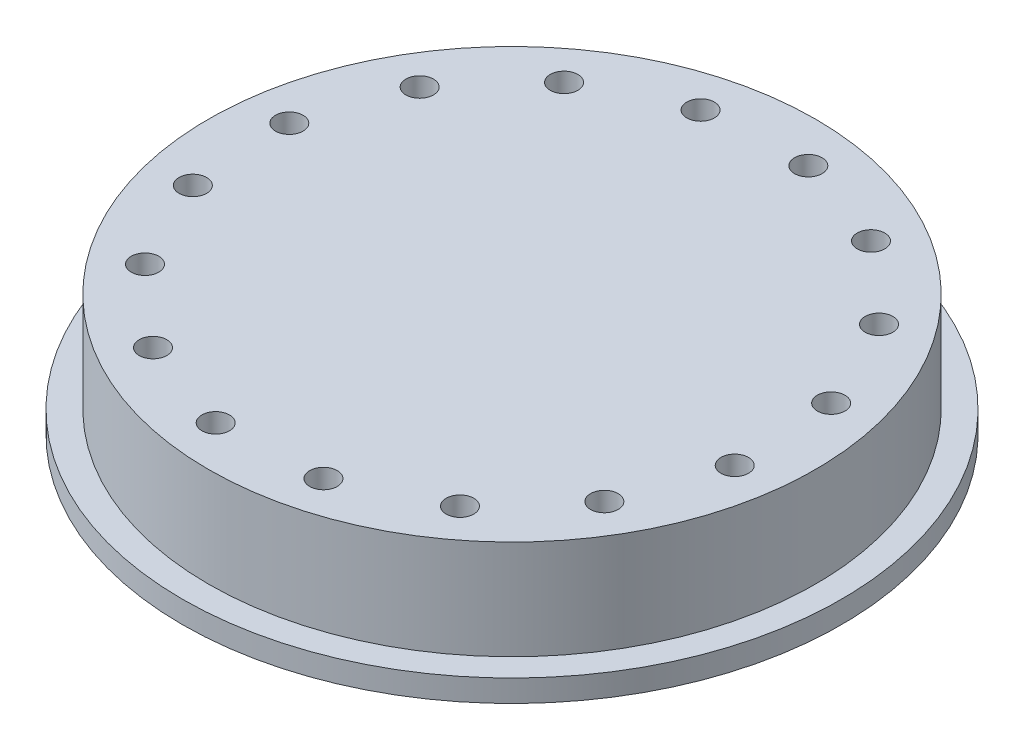
ISO-10303-21;
HEADER;
FILE_DESCRIPTION(('STEP AP214'),'2;1');
FILE_NAME('part.step','',(''),(''),'','','');
FILE_SCHEMA(('AUTOMOTIVE_DESIGN { 1 0 10303 214 1 1 1 1 }'));
ENDSEC;
DATA;
#1=APPLICATION_CONTEXT('core data for automotive mechanical design processes');
#2=APPLICATION_PROTOCOL_DEFINITION('international standard','automotive_design',2000,#1);
#3=PRODUCT_CONTEXT('',#1,'mechanical');
#4=PRODUCT('Part','Part','',(#3));
#5=PRODUCT_RELATED_PRODUCT_CATEGORY('part','',(#4));
#6=PRODUCT_DEFINITION_FORMATION('','',#4);
#7=PRODUCT_DEFINITION_CONTEXT('part definition',#1,'design');
#8=PRODUCT_DEFINITION('design','',#6,#7);
#9=PRODUCT_DEFINITION_SHAPE('','',#8);
#10=(LENGTH_UNIT() NAMED_UNIT(*) SI_UNIT(.MILLI.,.METRE.));
#11=(NAMED_UNIT(*) PLANE_ANGLE_UNIT() SI_UNIT($,.RADIAN.));
#12=(NAMED_UNIT(*) SI_UNIT($,.STERADIAN.) SOLID_ANGLE_UNIT());
#13=UNCERTAINTY_MEASURE_WITH_UNIT(LENGTH_MEASURE(1.E-05),#10,'distance_accuracy_value','');
#14=(GEOMETRIC_REPRESENTATION_CONTEXT(3) GLOBAL_UNCERTAINTY_ASSIGNED_CONTEXT((#13)) GLOBAL_UNIT_ASSIGNED_CONTEXT((#10,
#11,#12)) REPRESENTATION_CONTEXT('',''));
#15=CARTESIAN_POINT('',(0.,0.,0.));
#16=DIRECTION('',(0.,0.,1.));
#17=DIRECTION('',(1.,0.,0.));
#18=AXIS2_PLACEMENT_3D('',#15,#16,#17);
#19=CARTESIAN_POINT('',(0.,1.,0.));
#20=DIRECTION('',(0.,-1.,0.));
#21=DIRECTION('',(0.,0.,-1.));
#22=AXIS2_PLACEMENT_3D('',#19,#20,#21);
#23=CYLINDRICAL_SURFACE('',#22,29.86111111);
#24=CARTESIAN_POINT('',(0.,1.,0.));
#25=DIRECTION('',(0.,1.,0.));
#26=DIRECTION('',(0.,0.,1.));
#27=AXIS2_PLACEMENT_3D('',#24,#25,#26);
#28=CIRCLE('',#27,29.86111111);
#29=CARTESIAN_POINT('',(0.,1.,29.86111111));
#30=VERTEX_POINT('',#29);
#31=EDGE_CURVE('E44',#30,#30,#28,.T.);
#32=ORIENTED_EDGE('',*,*,#31,.F.);
#33=EDGE_LOOP('',(#32));
#34=FACE_BOUND('',#33,.T.);
#35=CARTESIAN_POINT('',(0.,-1.,0.));
#36=DIRECTION('',(0.,1.,0.));
#37=DIRECTION('',(0.,0.,1.));
#38=AXIS2_PLACEMENT_3D('',#35,#36,#37);
#39=CIRCLE('',#38,29.86111111);
#40=CARTESIAN_POINT('',(0.,-1.,29.86111111));
#41=VERTEX_POINT('',#40);
#42=EDGE_CURVE('E40',#41,#41,#39,.T.);
#43=ORIENTED_EDGE('',*,*,#42,.T.);
#44=EDGE_LOOP('',(#43));
#45=FACE_BOUND('',#44,.T.);
#46=ADVANCED_FACE('F37',(#34,#45),#23,.T.);
#47=CARTESIAN_POINT('',(0.,1.,0.));
#48=DIRECTION('',(0.,1.,0.));
#49=DIRECTION('',(0.,0.,1.));
#50=AXIS2_PLACEMENT_3D('',#47,#48,#49);
#51=PLANE('',#50);
#52=CARTESIAN_POINT('',(0.,1.,0.));
#53=DIRECTION('',(0.,1.,0.));
#54=DIRECTION('',(0.,0.,1.));
#55=AXIS2_PLACEMENT_3D('',#52,#53,#54);
#56=CIRCLE('',#55,27.5);
#57=CARTESIAN_POINT('',(0.,1.,27.5));
#58=VERTEX_POINT('',#57);
#59=EDGE_CURVE('E10',#58,#58,#56,.T.);
#60=ORIENTED_EDGE('',*,*,#59,.F.);
#61=EDGE_LOOP('',(#60));
#62=FACE_BOUND('',#61,.T.);
#63=ORIENTED_EDGE('',*,*,#31,.T.);
#64=EDGE_LOOP('',(#63));
#65=FACE_BOUND('',#64,.T.);
#66=ADVANCED_FACE('F165',(#62,#65),#51,.T.);
#67=CARTESIAN_POINT('',(0.,-1.,0.));
#68=DIRECTION('',(0.,1.,0.));
#69=DIRECTION('',(0.,0.,1.));
#70=AXIS2_PLACEMENT_3D('',#67,#68,#69);
#71=PLANE('',#70);
#72=CARTESIAN_POINT('',(18.9855230536122,-1.,-14.2692821957078));
#73=DIRECTION('',(0.,1.,0.));
#74=DIRECTION('',(0.,0.,1.));
#75=AXIS2_PLACEMENT_3D('',#72,#73,#74);
#76=CIRCLE('',#75,1.25);
#77=CARTESIAN_POINT('',(18.9855230536122,-1.,-13.0192821957078));
#78=VERTEX_POINT('',#77);
#79=EDGE_CURVE('E53',#78,#78,#76,.T.);
#80=ORIENTED_EDGE('',*,*,#79,.T.);
#81=EDGE_LOOP('',(#80));
#82=FACE_BOUND('',#81,.T.);
#83=CARTESIAN_POINT('',(14.2692821957152,-1.,18.9855230536135));
#84=DIRECTION('',(0.,1.,0.));
#85=DIRECTION('',(0.,0.,1.));
#86=AXIS2_PLACEMENT_3D('',#83,#84,#85);
#87=CIRCLE('',#86,1.25);
#88=CARTESIAN_POINT('',(14.2692821957152,-1.,20.2355230536135));
#89=VERTEX_POINT('',#88);
#90=EDGE_CURVE('E56',#89,#89,#87,.T.);
#91=ORIENTED_EDGE('',*,*,#90,.T.);
#92=EDGE_LOOP('',(#91));
#93=FACE_BOUND('',#92,.T.);
#94=CARTESIAN_POINT('',(20.448542891651,-1.,12.0797182752138));
#95=DIRECTION('',(0.,1.,0.));
#96=DIRECTION('',(0.,0.,1.));
#97=AXIS2_PLACEMENT_3D('',#94,#95,#96);
#98=CIRCLE('',#97,1.25);
#99=CARTESIAN_POINT('',(20.448542891651,-1.,13.3297182752138));
#100=VERTEX_POINT('',#99);
#101=EDGE_CURVE('E59',#100,#100,#98,.T.);
#102=ORIENTED_EDGE('',*,*,#101,.T.);
#103=EDGE_LOOP('',(#102));
#104=FACE_BOUND('',#103,.T.);
#105=CARTESIAN_POINT('',(23.5146982988361,-1.,3.3348858923322));
#106=DIRECTION('',(0.,1.,0.));
#107=DIRECTION('',(0.,0.,1.));
#108=AXIS2_PLACEMENT_3D('',#105,#106,#107);
#109=CIRCLE('',#108,1.25);
#110=CARTESIAN_POINT('',(23.5146982988361,-1.,4.5848858923322));
#111=VERTEX_POINT('',#110);
#112=EDGE_CURVE('E62',#111,#111,#109,.T.);
#113=ORIENTED_EDGE('',*,*,#112,.T.);
#114=EDGE_LOOP('',(#113));
#115=FACE_BOUND('',#114,.T.);
#116=CARTESIAN_POINT('',(5.91765263684751,-1.,23.0009540512963));
#117=DIRECTION('',(0.,1.,0.));
#118=DIRECTION('',(0.,0.,1.));
#119=AXIS2_PLACEMENT_3D('',#116,#117,#118);
#120=CIRCLE('',#119,1.25000000000003);
#121=CARTESIAN_POINT('',(5.91765263684751,-1.,24.2509540512964));
#122=VERTEX_POINT('',#121);
#123=EDGE_CURVE('E65',#122,#122,#120,.T.);
#124=ORIENTED_EDGE('',*,*,#123,.T.);
#125=EDGE_LOOP('',(#124));
#126=FACE_BOUND('',#125,.T.);
#127=CARTESIAN_POINT('',(-3.33488589232507,-1.,23.5146982988376));
#128=DIRECTION('',(0.,1.,0.));
#129=DIRECTION('',(0.,0.,1.));
#130=AXIS2_PLACEMENT_3D('',#127,#128,#129);
#131=CIRCLE('',#130,1.25);
#132=CARTESIAN_POINT('',(-3.33488589232507,-1.,24.7646982988376));
#133=VERTEX_POINT('',#132);
#134=EDGE_CURVE('E68',#133,#133,#131,.T.);
#135=ORIENTED_EDGE('',*,*,#134,.T.);
#136=EDGE_LOOP('',(#135));
#137=FACE_BOUND('',#136,.T.);
#138=CARTESIAN_POINT('',(-12.0797182752067,-1.,20.4485428916524));
#139=DIRECTION('',(0.,1.,0.));
#140=DIRECTION('',(0.,0.,1.));
#141=AXIS2_PLACEMENT_3D('',#138,#139,#140);
#142=CIRCLE('',#141,1.24999999999998);
#143=CARTESIAN_POINT('',(-12.0797182752067,-1.,21.6985428916524));
#144=VERTEX_POINT('',#143);
#145=EDGE_CURVE('E71',#144,#144,#142,.T.);
#146=ORIENTED_EDGE('',*,*,#145,.T.);
#147=EDGE_LOOP('',(#146));
#148=FACE_BOUND('',#147,.T.);
#149=CARTESIAN_POINT('',(-18.9855230536064,-1.,14.2692821957167));
#150=DIRECTION('',(0.,1.,0.));
#151=DIRECTION('',(0.,0.,1.));
#152=AXIS2_PLACEMENT_3D('',#149,#150,#151);
#153=CIRCLE('',#152,1.25);
#154=CARTESIAN_POINT('',(-18.9855230536064,-1.,15.5192821957167));
#155=VERTEX_POINT('',#154);
#156=EDGE_CURVE('E74',#155,#155,#153,.T.);
#157=ORIENTED_EDGE('',*,*,#156,.T.);
#158=EDGE_LOOP('',(#157));
#159=FACE_BOUND('',#158,.T.);
#160=CARTESIAN_POINT('',(-20.4485428916452,-1.,-12.0797182752052));
#161=DIRECTION('',(0.,1.,0.));
#162=DIRECTION('',(0.,0.,1.));
#163=AXIS2_PLACEMENT_3D('',#160,#161,#162);
#164=CIRCLE('',#163,1.25);
#165=CARTESIAN_POINT('',(-20.4485428916452,-1.,-10.8297182752052));
#166=VERTEX_POINT('',#165);
#167=EDGE_CURVE('E77',#166,#166,#164,.T.);
#168=ORIENTED_EDGE('',*,*,#167,.T.);
#169=EDGE_LOOP('',(#168));
#170=FACE_BOUND('',#169,.T.);
#171=CARTESIAN_POINT('',(-14.2692821957094,-1.,-18.9855230536049));
#172=DIRECTION('',(0.,1.,0.));
#173=DIRECTION('',(0.,0.,1.));
#174=AXIS2_PLACEMENT_3D('',#171,#172,#173);
#175=CIRCLE('',#174,1.24999999999999);
#176=CARTESIAN_POINT('',(-14.2692821957094,-1.,-17.7355230536049));
#177=VERTEX_POINT('',#176);
#178=EDGE_CURVE('E80',#177,#177,#175,.T.);
#179=ORIENTED_EDGE('',*,*,#178,.T.);
#180=EDGE_LOOP('',(#179));
#181=FACE_BOUND('',#180,.T.);
#182=CARTESIAN_POINT('',(-5.91765263684165,-1.,-23.0009540512877));
#183=DIRECTION('',(0.,1.,0.));
#184=DIRECTION('',(0.,0.,1.));
#185=AXIS2_PLACEMENT_3D('',#182,#183,#184);
#186=CIRCLE('',#185,1.25000000000002);
#187=CARTESIAN_POINT('',(-5.91765263684165,-1.,-21.7509540512877));
#188=VERTEX_POINT('',#187);
#189=EDGE_CURVE('E83',#188,#188,#186,.T.);
#190=ORIENTED_EDGE('',*,*,#189,.T.);
#191=EDGE_LOOP('',(#190));
#192=FACE_BOUND('',#191,.T.);
#193=CARTESIAN_POINT('',(3.33488589233093,-1.,-23.5146982988289));
#194=DIRECTION('',(0.,1.,0.));
#195=DIRECTION('',(0.,0.,1.));
#196=AXIS2_PLACEMENT_3D('',#193,#194,#195);
#197=CIRCLE('',#196,1.25);
#198=CARTESIAN_POINT('',(3.33488589233093,-1.,-22.2646982988289));
#199=VERTEX_POINT('',#198);
#200=EDGE_CURVE('E86',#199,#199,#197,.T.);
#201=ORIENTED_EDGE('',*,*,#200,.T.);
#202=EDGE_LOOP('',(#201));
#203=FACE_BOUND('',#202,.T.);
#204=CARTESIAN_POINT('',(12.0797182752125,-1.,-20.4485428916436));
#205=DIRECTION('',(0.,1.,0.));
#206=DIRECTION('',(0.,0.,1.));
#207=AXIS2_PLACEMENT_3D('',#204,#205,#206);
#208=CIRCLE('',#207,1.25);
#209=CARTESIAN_POINT('',(12.0797182752125,-1.,-19.1985428916436));
#210=VERTEX_POINT('',#209);
#211=EDGE_CURVE('E89',#210,#210,#208,.T.);
#212=ORIENTED_EDGE('',*,*,#211,.T.);
#213=EDGE_LOOP('',(#212));
#214=FACE_BOUND('',#213,.T.);
#215=CARTESIAN_POINT('',(-23.5146982988304,-1.,-3.33488589232348));
#216=DIRECTION('',(0.,1.,0.));
#217=DIRECTION('',(0.,0.,1.));
#218=AXIS2_PLACEMENT_3D('',#215,#216,#217);
#219=CIRCLE('',#218,1.25);
#220=CARTESIAN_POINT('',(-23.5146982988304,-1.,-2.08488589232348));
#221=VERTEX_POINT('',#220);
#222=EDGE_CURVE('E92',#221,#221,#219,.T.);
#223=ORIENTED_EDGE('',*,*,#222,.T.);
#224=EDGE_LOOP('',(#223));
#225=FACE_BOUND('',#224,.T.);
#226=CARTESIAN_POINT('',(-23.0009540512891,-1.,5.91765263684895));
#227=DIRECTION('',(0.,1.,0.));
#228=DIRECTION('',(0.,0.,1.));
#229=AXIS2_PLACEMENT_3D('',#226,#227,#228);
#230=CIRCLE('',#229,1.25);
#231=CARTESIAN_POINT('',(-23.0009540512891,-1.,7.16765263684895));
#232=VERTEX_POINT('',#231);
#233=EDGE_CURVE('E95',#232,#232,#230,.T.);
#234=ORIENTED_EDGE('',*,*,#233,.T.);
#235=EDGE_LOOP('',(#234));
#236=FACE_BOUND('',#235,.T.);
#237=CARTESIAN_POINT('',(23.0009540512949,-1.,-5.91765263684006));
#238=DIRECTION('',(0.,1.,0.));
#239=DIRECTION('',(0.,0.,1.));
#240=AXIS2_PLACEMENT_3D('',#237,#238,#239);
#241=CIRCLE('',#240,1.25);
#242=CARTESIAN_POINT('',(23.0009540512949,-1.,-4.66765263684005));
#243=VERTEX_POINT('',#242);
#244=EDGE_CURVE('E98',#243,#243,#241,.T.);
#245=ORIENTED_EDGE('',*,*,#244,.T.);
#246=EDGE_LOOP('',(#245));
#247=FACE_BOUND('',#246,.T.);
#248=ORIENTED_EDGE('',*,*,#42,.F.);
#249=EDGE_LOOP('',(#248));
#250=FACE_BOUND('',#249,.T.);
#251=ADVANCED_FACE('F161',(#82,#93,#104,#115,#126,#137,#148,#159,#170,#181,#192,#203,#214,#225,
#236,#247,#250),#71,.F.);
#252=CARTESIAN_POINT('',(0.,10.,0.));
#253=DIRECTION('',(0.,-1.,0.));
#254=DIRECTION('',(0.,0.,-1.));
#255=AXIS2_PLACEMENT_3D('',#252,#253,#254);
#256=CYLINDRICAL_SURFACE('',#255,27.5);
#257=CARTESIAN_POINT('',(0.,10.,0.));
#258=DIRECTION('',(0.,1.,0.));
#259=DIRECTION('',(0.,0.,1.));
#260=AXIS2_PLACEMENT_3D('',#257,#258,#259);
#261=CIRCLE('',#260,27.5);
#262=CARTESIAN_POINT('',(0.,10.,27.5));
#263=VERTEX_POINT('',#262);
#264=EDGE_CURVE('E50',#263,#263,#261,.T.);
#265=ORIENTED_EDGE('',*,*,#264,.F.);
#266=EDGE_LOOP('',(#265));
#267=FACE_BOUND('',#266,.T.);
#268=ORIENTED_EDGE('',*,*,#59,.T.);
#269=EDGE_LOOP('',(#268));
#270=FACE_BOUND('',#269,.T.);
#271=ADVANCED_FACE('F164',(#267,#270),#256,.T.);
#272=CARTESIAN_POINT('',(0.,10.,0.));
#273=DIRECTION('',(0.,1.,0.));
#274=DIRECTION('',(0.,0.,1.));
#275=AXIS2_PLACEMENT_3D('',#272,#273,#274);
#276=PLANE('',#275);
#277=CARTESIAN_POINT('',(18.9855230536122,10.,-14.2692821957078));
#278=DIRECTION('',(0.,-1.,0.));
#279=DIRECTION('',(0.,0.,-1.));
#280=AXIS2_PLACEMENT_3D('',#277,#278,#279);
#281=CIRCLE('',#280,1.25);
#282=CARTESIAN_POINT('',(18.9855230536122,10.,-15.5192821957078));
#283=VERTEX_POINT('',#282);
#284=EDGE_CURVE('E118',#283,#283,#281,.T.);
#285=ORIENTED_EDGE('',*,*,#284,.T.);
#286=EDGE_LOOP('',(#285));
#287=FACE_BOUND('',#286,.T.);
#288=CARTESIAN_POINT('',(14.2692821957152,10.,18.9855230536135));
#289=DIRECTION('',(0.,-1.,0.));
#290=DIRECTION('',(0.,0.,-1.));
#291=AXIS2_PLACEMENT_3D('',#288,#289,#290);
#292=CIRCLE('',#291,1.25);
#293=CARTESIAN_POINT('',(14.2692821957152,10.,17.7355230536135));
#294=VERTEX_POINT('',#293);
#295=EDGE_CURVE('E122',#294,#294,#292,.T.);
#296=ORIENTED_EDGE('',*,*,#295,.T.);
#297=EDGE_LOOP('',(#296));
#298=FACE_BOUND('',#297,.T.);
#299=CARTESIAN_POINT('',(20.448542891651,10.,12.0797182752138));
#300=DIRECTION('',(0.,-1.,0.));
#301=DIRECTION('',(0.,0.,-1.));
#302=AXIS2_PLACEMENT_3D('',#299,#300,#301);
#303=CIRCLE('',#302,1.25);
#304=CARTESIAN_POINT('',(20.448542891651,10.,10.8297182752138));
#305=VERTEX_POINT('',#304);
#306=EDGE_CURVE('E119',#305,#305,#303,.T.);
#307=ORIENTED_EDGE('',*,*,#306,.T.);
#308=EDGE_LOOP('',(#307));
#309=FACE_BOUND('',#308,.T.);
#310=CARTESIAN_POINT('',(23.5146982988361,10.,3.3348858923322));
#311=DIRECTION('',(0.,-1.,0.));
#312=DIRECTION('',(0.,0.,-1.));
#313=AXIS2_PLACEMENT_3D('',#310,#311,#312);
#314=CIRCLE('',#313,1.25);
#315=CARTESIAN_POINT('',(23.5146982988361,10.,2.08488589233219));
#316=VERTEX_POINT('',#315);
#317=EDGE_CURVE('E104',#316,#316,#314,.T.);
#318=ORIENTED_EDGE('',*,*,#317,.T.);
#319=EDGE_LOOP('',(#318));
#320=FACE_BOUND('',#319,.T.);
#321=CARTESIAN_POINT('',(5.91765263684751,10.,23.0009540512963));
#322=DIRECTION('',(0.,-1.,0.));
#323=DIRECTION('',(0.,0.,-1.));
#324=AXIS2_PLACEMENT_3D('',#321,#322,#323);
#325=CIRCLE('',#324,1.25000000000003);
#326=CARTESIAN_POINT('',(5.91765263684751,10.,21.7509540512963));
#327=VERTEX_POINT('',#326);
#328=EDGE_CURVE('E115',#327,#327,#325,.T.);
#329=ORIENTED_EDGE('',*,*,#328,.T.);
#330=EDGE_LOOP('',(#329));
#331=FACE_BOUND('',#330,.T.);
#332=CARTESIAN_POINT('',(-3.33488589232507,10.,23.5146982988376));
#333=DIRECTION('',(0.,-1.,0.));
#334=DIRECTION('',(0.,0.,-1.));
#335=AXIS2_PLACEMENT_3D('',#332,#333,#334);
#336=CIRCLE('',#335,1.25);
#337=CARTESIAN_POINT('',(-3.33488589232507,10.,22.2646982988376));
#338=VERTEX_POINT('',#337);
#339=EDGE_CURVE('E112',#338,#338,#336,.T.);
#340=ORIENTED_EDGE('',*,*,#339,.T.);
#341=EDGE_LOOP('',(#340));
#342=FACE_BOUND('',#341,.T.);
#343=CARTESIAN_POINT('',(-12.0797182752067,10.,20.4485428916524));
#344=DIRECTION('',(0.,-1.,0.));
#345=DIRECTION('',(0.,0.,-1.));
#346=AXIS2_PLACEMENT_3D('',#343,#344,#345);
#347=CIRCLE('',#346,1.24999999999998);
#348=CARTESIAN_POINT('',(-12.0797182752067,10.,19.1985428916525));
#349=VERTEX_POINT('',#348);
#350=EDGE_CURVE('E108',#349,#349,#347,.T.);
#351=ORIENTED_EDGE('',*,*,#350,.T.);
#352=EDGE_LOOP('',(#351));
#353=FACE_BOUND('',#352,.T.);
#354=CARTESIAN_POINT('',(-18.9855230536064,10.,14.2692821957167));
#355=DIRECTION('',(0.,-1.,0.));
#356=DIRECTION('',(0.,0.,-1.));
#357=AXIS2_PLACEMENT_3D('',#354,#355,#356);
#358=CIRCLE('',#357,1.25);
#359=CARTESIAN_POINT('',(-18.9855230536064,10.,13.0192821957167));
#360=VERTEX_POINT('',#359);
#361=EDGE_CURVE('E105',#360,#360,#358,.T.);
#362=ORIENTED_EDGE('',*,*,#361,.T.);
#363=EDGE_LOOP('',(#362));
#364=FACE_BOUND('',#363,.T.);
#365=CARTESIAN_POINT('',(-20.4485428916452,10.,-12.0797182752052));
#366=DIRECTION('',(0.,-1.,0.));
#367=DIRECTION('',(0.,0.,-1.));
#368=AXIS2_PLACEMENT_3D('',#365,#366,#367);
#369=CIRCLE('',#368,1.25);
#370=CARTESIAN_POINT('',(-20.4485428916452,10.,-13.3297182752052));
#371=VERTEX_POINT('',#370);
#372=EDGE_CURVE('E141',#371,#371,#369,.T.);
#373=ORIENTED_EDGE('',*,*,#372,.T.);
#374=EDGE_LOOP('',(#373));
#375=FACE_BOUND('',#374,.T.);
#376=CARTESIAN_POINT('',(-14.2692821957094,10.,-18.9855230536049));
#377=DIRECTION('',(0.,-1.,0.));
#378=DIRECTION('',(0.,0.,-1.));
#379=AXIS2_PLACEMENT_3D('',#376,#377,#378);
#380=CIRCLE('',#379,1.24999999999999);
#381=CARTESIAN_POINT('',(-14.2692821957094,10.,-20.2355230536049));
#382=VERTEX_POINT('',#381);
#383=EDGE_CURVE('E144',#382,#382,#380,.T.);
#384=ORIENTED_EDGE('',*,*,#383,.T.);
#385=EDGE_LOOP('',(#384));
#386=FACE_BOUND('',#385,.T.);
#387=CARTESIAN_POINT('',(-5.91765263684165,10.,-23.0009540512877));
#388=DIRECTION('',(0.,-1.,0.));
#389=DIRECTION('',(0.,0.,-1.));
#390=AXIS2_PLACEMENT_3D('',#387,#388,#389);
#391=CIRCLE('',#390,1.25000000000002);
#392=CARTESIAN_POINT('',(-5.91765263684165,10.,-24.2509540512877));
#393=VERTEX_POINT('',#392);
#394=EDGE_CURVE('E133',#393,#393,#391,.T.);
#395=ORIENTED_EDGE('',*,*,#394,.T.);
#396=EDGE_LOOP('',(#395));
#397=FACE_BOUND('',#396,.T.);
#398=CARTESIAN_POINT('',(3.33488589233093,10.,-23.5146982988289));
#399=DIRECTION('',(0.,-1.,0.));
#400=DIRECTION('',(0.,0.,-1.));
#401=AXIS2_PLACEMENT_3D('',#398,#399,#400);
#402=CIRCLE('',#401,1.25);
#403=CARTESIAN_POINT('',(3.33488589233093,10.,-24.7646982988289));
#404=VERTEX_POINT('',#403);
#405=EDGE_CURVE('E129',#404,#404,#402,.T.);
#406=ORIENTED_EDGE('',*,*,#405,.T.);
#407=EDGE_LOOP('',(#406));
#408=FACE_BOUND('',#407,.T.);
#409=CARTESIAN_POINT('',(12.0797182752125,10.,-20.4485428916436));
#410=DIRECTION('',(0.,-1.,0.));
#411=DIRECTION('',(0.,0.,-1.));
#412=AXIS2_PLACEMENT_3D('',#409,#410,#411);
#413=CIRCLE('',#412,1.25);
#414=CARTESIAN_POINT('',(12.0797182752125,10.,-21.6985428916436));
#415=VERTEX_POINT('',#414);
#416=EDGE_CURVE('E132',#415,#415,#413,.T.);
#417=ORIENTED_EDGE('',*,*,#416,.T.);
#418=EDGE_LOOP('',(#417));
#419=FACE_BOUND('',#418,.T.);
#420=CARTESIAN_POINT('',(-23.5146982988304,10.,-3.33488589232348));
#421=DIRECTION('',(0.,-1.,0.));
#422=DIRECTION('',(0.,0.,-1.));
#423=AXIS2_PLACEMENT_3D('',#420,#421,#422);
#424=CIRCLE('',#423,1.25);
#425=CARTESIAN_POINT('',(-23.5146982988304,10.,-4.58488589232348));
#426=VERTEX_POINT('',#425);
#427=EDGE_CURVE('E136',#426,#426,#424,.T.);
#428=ORIENTED_EDGE('',*,*,#427,.T.);
#429=EDGE_LOOP('',(#428));
#430=FACE_BOUND('',#429,.T.);
#431=CARTESIAN_POINT('',(-23.0009540512891,10.,5.91765263684895));
#432=DIRECTION('',(0.,-1.,0.));
#433=DIRECTION('',(0.,0.,-1.));
#434=AXIS2_PLACEMENT_3D('',#431,#432,#433);
#435=CIRCLE('',#434,1.25);
#436=CARTESIAN_POINT('',(-23.0009540512891,10.,4.66765263684895));
#437=VERTEX_POINT('',#436);
#438=EDGE_CURVE('E109',#437,#437,#435,.T.);
#439=ORIENTED_EDGE('',*,*,#438,.T.);
#440=EDGE_LOOP('',(#439));
#441=FACE_BOUND('',#440,.T.);
#442=CARTESIAN_POINT('',(23.0009540512949,10.,-5.91765263684006));
#443=DIRECTION('',(0.,-1.,0.));
#444=DIRECTION('',(0.,0.,-1.));
#445=AXIS2_PLACEMENT_3D('',#442,#443,#444);
#446=CIRCLE('',#445,1.25);
#447=CARTESIAN_POINT('',(23.0009540512949,10.,-7.16765263684006));
#448=VERTEX_POINT('',#447);
#449=EDGE_CURVE('E101',#448,#448,#446,.T.);
#450=ORIENTED_EDGE('',*,*,#449,.T.);
#451=EDGE_LOOP('',(#450));
#452=FACE_BOUND('',#451,.T.);
#453=ORIENTED_EDGE('',*,*,#264,.T.);
#454=EDGE_LOOP('',(#453));
#455=FACE_BOUND('',#454,.T.);
#456=ADVANCED_FACE('F150',(#287,#298,#309,#320,#331,#342,#353,#364,#375,#386,#397,#408,#419,
#430,#441,#452,#455),#276,.T.);
#457=CARTESIAN_POINT('',(23.0009540512949,10.,-5.91765263684006));
#458=DIRECTION('',(0.,-1.,0.));
#459=DIRECTION('',(0.,0.,-1.));
#460=AXIS2_PLACEMENT_3D('',#457,#458,#459);
#461=CYLINDRICAL_SURFACE('',#460,1.25);
#462=ORIENTED_EDGE('',*,*,#449,.F.);
#463=EDGE_LOOP('',(#462));
#464=FACE_BOUND('',#463,.T.);
#465=ORIENTED_EDGE('',*,*,#244,.F.);
#466=EDGE_LOOP('',(#465));
#467=FACE_BOUND('',#466,.T.);
#468=ADVANCED_FACE('F197',(#464,#467),#461,.F.);
#469=CARTESIAN_POINT('',(-23.0009540512891,10.,5.91765263684895));
#470=DIRECTION('',(0.,-1.,0.));
#471=DIRECTION('',(0.,0.,-1.));
#472=AXIS2_PLACEMENT_3D('',#469,#470,#471);
#473=CYLINDRICAL_SURFACE('',#472,1.25);
#474=ORIENTED_EDGE('',*,*,#438,.F.);
#475=EDGE_LOOP('',(#474));
#476=FACE_BOUND('',#475,.T.);
#477=ORIENTED_EDGE('',*,*,#233,.F.);
#478=EDGE_LOOP('',(#477));
#479=FACE_BOUND('',#478,.T.);
#480=ADVANCED_FACE('F201',(#476,#479),#473,.F.);
#481=CARTESIAN_POINT('',(-23.5146982988304,10.,-3.33488589232348));
#482=DIRECTION('',(0.,-1.,0.));
#483=DIRECTION('',(0.,0.,-1.));
#484=AXIS2_PLACEMENT_3D('',#481,#482,#483);
#485=CYLINDRICAL_SURFACE('',#484,1.25);
#486=ORIENTED_EDGE('',*,*,#427,.F.);
#487=EDGE_LOOP('',(#486));
#488=FACE_BOUND('',#487,.T.);
#489=ORIENTED_EDGE('',*,*,#222,.F.);
#490=EDGE_LOOP('',(#489));
#491=FACE_BOUND('',#490,.T.);
#492=ADVANCED_FACE('F242',(#488,#491),#485,.F.);
#493=CARTESIAN_POINT('',(12.0797182752125,10.,-20.4485428916436));
#494=DIRECTION('',(0.,-1.,0.));
#495=DIRECTION('',(0.,0.,-1.));
#496=AXIS2_PLACEMENT_3D('',#493,#494,#495);
#497=CYLINDRICAL_SURFACE('',#496,1.25);
#498=ORIENTED_EDGE('',*,*,#416,.F.);
#499=EDGE_LOOP('',(#498));
#500=FACE_BOUND('',#499,.T.);
#501=ORIENTED_EDGE('',*,*,#211,.F.);
#502=EDGE_LOOP('',(#501));
#503=FACE_BOUND('',#502,.T.);
#504=ADVANCED_FACE('F238',(#500,#503),#497,.F.);
#505=CARTESIAN_POINT('',(3.33488589233093,10.,-23.5146982988289));
#506=DIRECTION('',(0.,-1.,0.));
#507=DIRECTION('',(0.,0.,-1.));
#508=AXIS2_PLACEMENT_3D('',#505,#506,#507);
#509=CYLINDRICAL_SURFACE('',#508,1.25);
#510=ORIENTED_EDGE('',*,*,#405,.F.);
#511=EDGE_LOOP('',(#510));
#512=FACE_BOUND('',#511,.T.);
#513=ORIENTED_EDGE('',*,*,#200,.F.);
#514=EDGE_LOOP('',(#513));
#515=FACE_BOUND('',#514,.T.);
#516=ADVANCED_FACE('F157',(#512,#515),#509,.F.);
#517=CARTESIAN_POINT('',(-5.91765263684165,10.,-23.0009540512877));
#518=DIRECTION('',(0.,-1.,0.));
#519=DIRECTION('',(0.,0.,-1.));
#520=AXIS2_PLACEMENT_3D('',#517,#518,#519);
#521=CYLINDRICAL_SURFACE('',#520,1.25000000000002);
#522=ORIENTED_EDGE('',*,*,#394,.F.);
#523=EDGE_LOOP('',(#522));
#524=FACE_BOUND('',#523,.T.);
#525=ORIENTED_EDGE('',*,*,#189,.F.);
#526=EDGE_LOOP('',(#525));
#527=FACE_BOUND('',#526,.T.);
#528=ADVANCED_FACE('F153',(#524,#527),#521,.F.);
#529=CARTESIAN_POINT('',(-14.2692821957094,10.,-18.9855230536049));
#530=DIRECTION('',(0.,-1.,0.));
#531=DIRECTION('',(0.,0.,-1.));
#532=AXIS2_PLACEMENT_3D('',#529,#530,#531);
#533=CYLINDRICAL_SURFACE('',#532,1.24999999999999);
#534=ORIENTED_EDGE('',*,*,#383,.F.);
#535=EDGE_LOOP('',(#534));
#536=FACE_BOUND('',#535,.T.);
#537=ORIENTED_EDGE('',*,*,#178,.F.);
#538=EDGE_LOOP('',(#537));
#539=FACE_BOUND('',#538,.T.);
#540=ADVANCED_FACE('F156',(#536,#539),#533,.F.);
#541=CARTESIAN_POINT('',(-20.4485428916452,10.,-12.0797182752052));
#542=DIRECTION('',(0.,-1.,0.));
#543=DIRECTION('',(0.,0.,-1.));
#544=AXIS2_PLACEMENT_3D('',#541,#542,#543);
#545=CYLINDRICAL_SURFACE('',#544,1.25);
#546=ORIENTED_EDGE('',*,*,#372,.F.);
#547=EDGE_LOOP('',(#546));
#548=FACE_BOUND('',#547,.T.);
#549=ORIENTED_EDGE('',*,*,#167,.F.);
#550=EDGE_LOOP('',(#549));
#551=FACE_BOUND('',#550,.T.);
#552=ADVANCED_FACE('F207',(#548,#551),#545,.F.);
#553=CARTESIAN_POINT('',(-18.9855230536064,10.,14.2692821957167));
#554=DIRECTION('',(0.,-1.,0.));
#555=DIRECTION('',(0.,0.,-1.));
#556=AXIS2_PLACEMENT_3D('',#553,#554,#555);
#557=CYLINDRICAL_SURFACE('',#556,1.25);
#558=ORIENTED_EDGE('',*,*,#361,.F.);
#559=EDGE_LOOP('',(#558));
#560=FACE_BOUND('',#559,.T.);
#561=ORIENTED_EDGE('',*,*,#156,.F.);
#562=EDGE_LOOP('',(#561));
#563=FACE_BOUND('',#562,.T.);
#564=ADVANCED_FACE('F203',(#560,#563),#557,.F.);
#565=CARTESIAN_POINT('',(-12.0797182752067,10.,20.4485428916524));
#566=DIRECTION('',(0.,-1.,0.));
#567=DIRECTION('',(0.,0.,-1.));
#568=AXIS2_PLACEMENT_3D('',#565,#566,#567);
#569=CYLINDRICAL_SURFACE('',#568,1.24999999999998);
#570=ORIENTED_EDGE('',*,*,#350,.F.);
#571=EDGE_LOOP('',(#570));
#572=FACE_BOUND('',#571,.T.);
#573=ORIENTED_EDGE('',*,*,#145,.F.);
#574=EDGE_LOOP('',(#573));
#575=FACE_BOUND('',#574,.T.);
#576=ADVANCED_FACE('F206',(#572,#575),#569,.F.);
#577=CARTESIAN_POINT('',(-3.33488589232507,10.,23.5146982988376));
#578=DIRECTION('',(0.,-1.,0.));
#579=DIRECTION('',(0.,0.,-1.));
#580=AXIS2_PLACEMENT_3D('',#577,#578,#579);
#581=CYLINDRICAL_SURFACE('',#580,1.25);
#582=ORIENTED_EDGE('',*,*,#339,.F.);
#583=EDGE_LOOP('',(#582));
#584=FACE_BOUND('',#583,.T.);
#585=ORIENTED_EDGE('',*,*,#134,.F.);
#586=EDGE_LOOP('',(#585));
#587=FACE_BOUND('',#586,.T.);
#588=ADVANCED_FACE('F211',(#584,#587),#581,.F.);
#589=CARTESIAN_POINT('',(5.91765263684751,10.,23.0009540512963));
#590=DIRECTION('',(0.,-1.,0.));
#591=DIRECTION('',(0.,0.,-1.));
#592=AXIS2_PLACEMENT_3D('',#589,#590,#591);
#593=CYLINDRICAL_SURFACE('',#592,1.25000000000003);
#594=ORIENTED_EDGE('',*,*,#328,.F.);
#595=EDGE_LOOP('',(#594));
#596=FACE_BOUND('',#595,.T.);
#597=ORIENTED_EDGE('',*,*,#123,.F.);
#598=EDGE_LOOP('',(#597));
#599=FACE_BOUND('',#598,.T.);
#600=ADVANCED_FACE('F215',(#596,#599),#593,.F.);
#601=CARTESIAN_POINT('',(23.5146982988361,10.,3.3348858923322));
#602=DIRECTION('',(0.,-1.,0.));
#603=DIRECTION('',(0.,0.,-1.));
#604=AXIS2_PLACEMENT_3D('',#601,#602,#603);
#605=CYLINDRICAL_SURFACE('',#604,1.25);
#606=ORIENTED_EDGE('',*,*,#317,.F.);
#607=EDGE_LOOP('',(#606));
#608=FACE_BOUND('',#607,.T.);
#609=ORIENTED_EDGE('',*,*,#112,.F.);
#610=EDGE_LOOP('',(#609));
#611=FACE_BOUND('',#610,.T.);
#612=ADVANCED_FACE('F219',(#608,#611),#605,.F.);
#613=CARTESIAN_POINT('',(20.448542891651,10.,12.0797182752138));
#614=DIRECTION('',(0.,-1.,0.));
#615=DIRECTION('',(0.,0.,-1.));
#616=AXIS2_PLACEMENT_3D('',#613,#614,#615);
#617=CYLINDRICAL_SURFACE('',#616,1.25);
#618=ORIENTED_EDGE('',*,*,#306,.F.);
#619=EDGE_LOOP('',(#618));
#620=FACE_BOUND('',#619,.T.);
#621=ORIENTED_EDGE('',*,*,#101,.F.);
#622=EDGE_LOOP('',(#621));
#623=FACE_BOUND('',#622,.T.);
#624=ADVANCED_FACE('F221',(#620,#623),#617,.F.);
#625=CARTESIAN_POINT('',(14.2692821957152,10.,18.9855230536135));
#626=DIRECTION('',(0.,-1.,0.));
#627=DIRECTION('',(0.,0.,-1.));
#628=AXIS2_PLACEMENT_3D('',#625,#626,#627);
#629=CYLINDRICAL_SURFACE('',#628,1.25);
#630=ORIENTED_EDGE('',*,*,#295,.F.);
#631=EDGE_LOOP('',(#630));
#632=FACE_BOUND('',#631,.T.);
#633=ORIENTED_EDGE('',*,*,#90,.F.);
#634=EDGE_LOOP('',(#633));
#635=FACE_BOUND('',#634,.T.);
#636=ADVANCED_FACE('F224',(#632,#635),#629,.F.);
#637=CARTESIAN_POINT('',(18.9855230536122,10.,-14.2692821957078));
#638=DIRECTION('',(0.,-1.,0.));
#639=DIRECTION('',(0.,0.,-1.));
#640=AXIS2_PLACEMENT_3D('',#637,#638,#639);
#641=CYLINDRICAL_SURFACE('',#640,1.25);
#642=ORIENTED_EDGE('',*,*,#284,.F.);
#643=EDGE_LOOP('',(#642));
#644=FACE_BOUND('',#643,.T.);
#645=ORIENTED_EDGE('',*,*,#79,.F.);
#646=EDGE_LOOP('',(#645));
#647=FACE_BOUND('',#646,.T.);
#648=ADVANCED_FACE('F229',(#644,#647),#641,.F.);
#649=CLOSED_SHELL('',(#46,#66,#251,#271,#456,#468,#480,#492,#504,#516,#528,#540,#552,#564,#576,
#588,#600,#612,#624,#636,#648));
#650=MANIFOLD_SOLID_BREP('B2',#649);
#651=ADVANCED_BREP_SHAPE_REPRESENTATION('',(#18,#650),#14);
#652=SHAPE_DEFINITION_REPRESENTATION(#9,#651);
ENDSEC;
END-ISO-10303-21;
